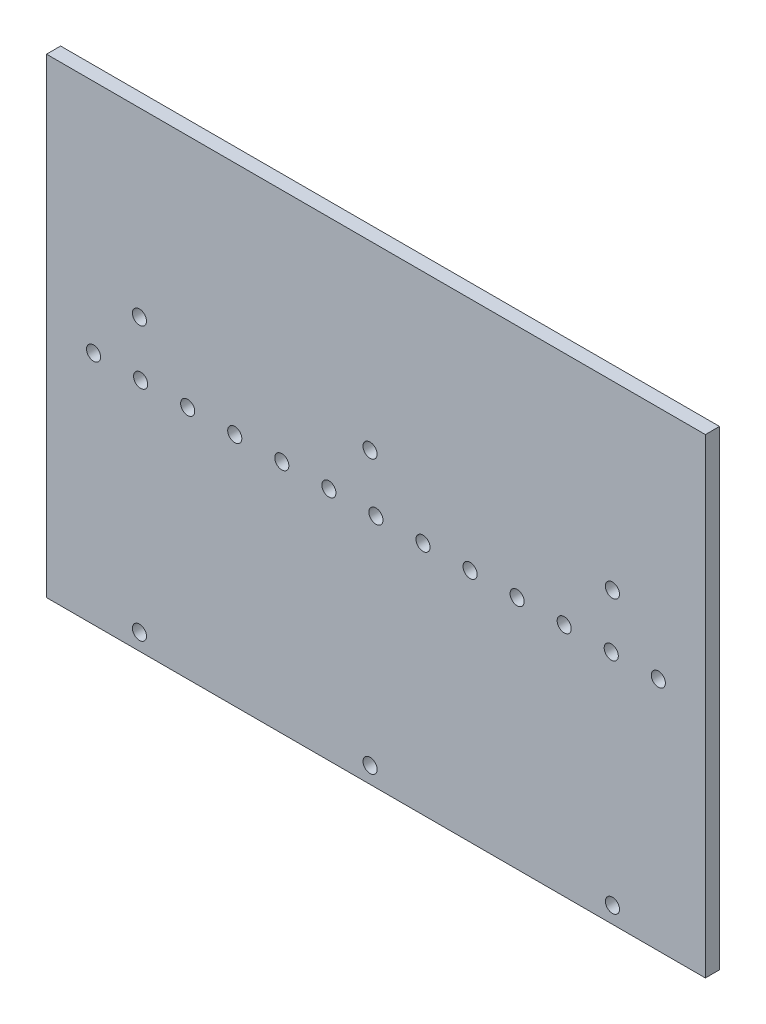
ISO-10303-21;
HEADER;
FILE_DESCRIPTION(('STEP AP214'),'2;1');
FILE_NAME('part.step','',(''),(''),'','','');
FILE_SCHEMA(('AUTOMOTIVE_DESIGN { 1 0 10303 214 1 1 1 1 }'));
ENDSEC;
DATA;
#1=APPLICATION_CONTEXT('core data for automotive mechanical design processes');
#2=APPLICATION_PROTOCOL_DEFINITION('international standard','automotive_design',2000,#1);
#3=PRODUCT_CONTEXT('',#1,'mechanical');
#4=PRODUCT('Part','Part','',(#3));
#5=PRODUCT_RELATED_PRODUCT_CATEGORY('part','',(#4));
#6=PRODUCT_DEFINITION_FORMATION('','',#4);
#7=PRODUCT_DEFINITION_CONTEXT('part definition',#1,'design');
#8=PRODUCT_DEFINITION('design','',#6,#7);
#9=PRODUCT_DEFINITION_SHAPE('','',#8);
#10=(LENGTH_UNIT() NAMED_UNIT(*) SI_UNIT(.MILLI.,.METRE.));
#11=(NAMED_UNIT(*) PLANE_ANGLE_UNIT() SI_UNIT($,.RADIAN.));
#12=(NAMED_UNIT(*) SI_UNIT($,.STERADIAN.) SOLID_ANGLE_UNIT());
#13=UNCERTAINTY_MEASURE_WITH_UNIT(LENGTH_MEASURE(1.E-05),#10,'distance_accuracy_value','');
#14=(GEOMETRIC_REPRESENTATION_CONTEXT(3) GLOBAL_UNCERTAINTY_ASSIGNED_CONTEXT((#13)) GLOBAL_UNIT_ASSIGNED_CONTEXT((#10,
#11,#12)) REPRESENTATION_CONTEXT('',''));
#15=CARTESIAN_POINT('',(0.,0.,0.));
#16=DIRECTION('',(0.,0.,1.));
#17=DIRECTION('',(1.,0.,0.));
#18=AXIS2_PLACEMENT_3D('',#15,#16,#17);
#19=CARTESIAN_POINT('',(70.,50.,3.));
#20=DIRECTION('',(-1.,0.,0.));
#21=DIRECTION('',(0.,0.,1.));
#22=AXIS2_PLACEMENT_3D('',#19,#20,#21);
#23=PLANE('',#22);
#24=DIRECTION('',(0.,1.,0.));
#25=VECTOR('',#24,1.);
#26=CARTESIAN_POINT('',(70.,50.,0.));
#27=LINE('',#26,#25);
#28=CARTESIAN_POINT('',(70.,-50.,0.));
#29=VERTEX_POINT('',#28);
#30=CARTESIAN_POINT('',(70.,50.,0.));
#31=VERTEX_POINT('',#30);
#32=EDGE_CURVE('E114',#29,#31,#27,.T.);
#33=ORIENTED_EDGE('',*,*,#32,.T.);
#34=DIRECTION('',(0.,0.,-1.));
#35=VECTOR('',#34,1.);
#36=CARTESIAN_POINT('',(70.,50.,3.));
#37=LINE('',#36,#35);
#38=CARTESIAN_POINT('',(70.,50.,3.));
#39=VERTEX_POINT('',#38);
#40=EDGE_CURVE('E11',#39,#31,#37,.T.);
#41=ORIENTED_EDGE('',*,*,#40,.F.);
#42=DIRECTION('',(0.,1.,0.));
#43=VECTOR('',#42,1.);
#44=CARTESIAN_POINT('',(70.,50.,3.));
#45=LINE('',#44,#43);
#46=CARTESIAN_POINT('',(70.,-50.,3.));
#47=VERTEX_POINT('',#46);
#48=EDGE_CURVE('E97',#47,#39,#45,.T.);
#49=ORIENTED_EDGE('',*,*,#48,.F.);
#50=DIRECTION('',(0.,0.,-1.));
#51=VECTOR('',#50,1.);
#52=CARTESIAN_POINT('',(70.,-50.,3.));
#53=LINE('',#52,#51);
#54=EDGE_CURVE('E110',#47,#29,#53,.T.);
#55=ORIENTED_EDGE('',*,*,#54,.T.);
#56=EDGE_LOOP('',(#33,#41,#49,#55));
#57=FACE_BOUND('',#56,.T.);
#58=ADVANCED_FACE('F43',(#57),#23,.F.);
#59=CARTESIAN_POINT('',(-70.,50.,3.));
#60=DIRECTION('',(0.,-1.,0.));
#61=DIRECTION('',(0.,0.,-1.));
#62=AXIS2_PLACEMENT_3D('',#59,#60,#61);
#63=PLANE('',#62);
#64=DIRECTION('',(-1.,0.,0.));
#65=VECTOR('',#64,1.);
#66=CARTESIAN_POINT('',(-70.,50.,0.));
#67=LINE('',#66,#65);
#68=CARTESIAN_POINT('',(-70.,50.,0.));
#69=VERTEX_POINT('',#68);
#70=EDGE_CURVE('E102',#31,#69,#67,.T.);
#71=ORIENTED_EDGE('',*,*,#70,.T.);
#72=DIRECTION('',(0.,0.,-1.));
#73=VECTOR('',#72,1.);
#74=CARTESIAN_POINT('',(-70.,50.,3.));
#75=LINE('',#74,#73);
#76=CARTESIAN_POINT('',(-70.,50.,3.));
#77=VERTEX_POINT('',#76);
#78=EDGE_CURVE('E53',#77,#69,#75,.T.);
#79=ORIENTED_EDGE('',*,*,#78,.F.);
#80=DIRECTION('',(-1.,0.,0.));
#81=VECTOR('',#80,1.);
#82=CARTESIAN_POINT('',(-70.,50.,3.));
#83=LINE('',#82,#81);
#84=EDGE_CURVE('E92',#39,#77,#83,.T.);
#85=ORIENTED_EDGE('',*,*,#84,.F.);
#86=ORIENTED_EDGE('',*,*,#40,.T.);
#87=EDGE_LOOP('',(#71,#79,#85,#86));
#88=FACE_BOUND('',#87,.T.);
#89=ADVANCED_FACE('F101',(#88),#63,.F.);
#90=CARTESIAN_POINT('',(-70.,50.,3.));
#91=DIRECTION('',(1.,0.,0.));
#92=DIRECTION('',(0.,1.,0.));
#93=AXIS2_PLACEMENT_3D('',#90,#91,#92);
#94=PLANE('',#93);
#95=DIRECTION('',(0.,-1.,0.));
#96=VECTOR('',#95,1.);
#97=CARTESIAN_POINT('',(-70.,50.,0.));
#98=LINE('',#97,#96);
#99=CARTESIAN_POINT('',(-70.,-50.,0.));
#100=VERTEX_POINT('',#99);
#101=EDGE_CURVE('E79',#69,#100,#98,.T.);
#102=ORIENTED_EDGE('',*,*,#101,.T.);
#103=DIRECTION('',(0.,0.,-1.));
#104=VECTOR('',#103,1.);
#105=CARTESIAN_POINT('',(-70.,-50.,3.));
#106=LINE('',#105,#104);
#107=CARTESIAN_POINT('',(-70.,-50.,3.));
#108=VERTEX_POINT('',#107);
#109=EDGE_CURVE('E104',#108,#100,#106,.T.);
#110=ORIENTED_EDGE('',*,*,#109,.F.);
#111=DIRECTION('',(0.,-1.,0.));
#112=VECTOR('',#111,1.);
#113=CARTESIAN_POINT('',(-70.,50.,3.));
#114=LINE('',#113,#112);
#115=EDGE_CURVE('E95',#77,#108,#114,.T.);
#116=ORIENTED_EDGE('',*,*,#115,.F.);
#117=ORIENTED_EDGE('',*,*,#78,.T.);
#118=EDGE_LOOP('',(#102,#110,#116,#117));
#119=FACE_BOUND('',#118,.T.);
#120=ADVANCED_FACE('F106',(#119),#94,.F.);
#121=CARTESIAN_POINT('',(-70.,-50.,3.));
#122=DIRECTION('',(0.,1.,0.));
#123=DIRECTION('',(0.,0.,1.));
#124=AXIS2_PLACEMENT_3D('',#121,#122,#123);
#125=PLANE('',#124);
#126=DIRECTION('',(1.,0.,0.));
#127=VECTOR('',#126,1.);
#128=CARTESIAN_POINT('',(-70.,-50.,0.));
#129=LINE('',#128,#127);
#130=EDGE_CURVE('E85',#100,#29,#129,.T.);
#131=ORIENTED_EDGE('',*,*,#130,.T.);
#132=ORIENTED_EDGE('',*,*,#54,.F.);
#133=DIRECTION('',(1.,0.,0.));
#134=VECTOR('',#133,1.);
#135=CARTESIAN_POINT('',(-70.,-50.,3.));
#136=LINE('',#135,#134);
#137=EDGE_CURVE('E62',#108,#47,#136,.T.);
#138=ORIENTED_EDGE('',*,*,#137,.F.);
#139=ORIENTED_EDGE('',*,*,#109,.T.);
#140=EDGE_LOOP('',(#131,#132,#138,#139));
#141=FACE_BOUND('',#140,.T.);
#142=ADVANCED_FACE('F293',(#141),#125,.F.);
#143=CARTESIAN_POINT('',(0.,0.,3.));
#144=DIRECTION('',(0.,0.,1.));
#145=DIRECTION('',(1.,0.,0.));
#146=AXIS2_PLACEMENT_3D('',#143,#144,#145);
#147=PLANE('',#146);
#148=CARTESIAN_POINT('',(50.25,-46.5,3.));
#149=DIRECTION('',(0.,0.,1.));
#150=DIRECTION('',(1.,0.,0.));
#151=AXIS2_PLACEMENT_3D('',#148,#149,#150);
#152=CIRCLE('',#151,1.5);
#153=CARTESIAN_POINT('',(51.75,-46.5,3.));
#154=VERTEX_POINT('',#153);
#155=EDGE_CURVE('E266',#154,#154,#152,.T.);
#156=ORIENTED_EDGE('',*,*,#155,.F.);
#157=EDGE_LOOP('',(#156));
#158=FACE_BOUND('',#157,.T.);
#159=CARTESIAN_POINT('',(-50.25,-46.5,3.));
#160=DIRECTION('',(0.,0.,1.));
#161=DIRECTION('',(1.,0.,0.));
#162=AXIS2_PLACEMENT_3D('',#159,#160,#161);
#163=CIRCLE('',#162,1.5);
#164=CARTESIAN_POINT('',(-48.75,-46.5,3.));
#165=VERTEX_POINT('',#164);
#166=EDGE_CURVE('E276',#165,#165,#163,.T.);
#167=ORIENTED_EDGE('',*,*,#166,.F.);
#168=EDGE_LOOP('',(#167));
#169=FACE_BOUND('',#168,.T.);
#170=CARTESIAN_POINT('',(-1.24999999999998,11.5,3.));
#171=DIRECTION('',(0.,0.,1.));
#172=DIRECTION('',(1.,0.,0.));
#173=AXIS2_PLACEMENT_3D('',#170,#171,#172);
#174=CIRCLE('',#173,1.5);
#175=CARTESIAN_POINT('',(0.25000000000002,11.5,3.));
#176=VERTEX_POINT('',#175);
#177=EDGE_CURVE('E271',#176,#176,#174,.T.);
#178=ORIENTED_EDGE('',*,*,#177,.F.);
#179=EDGE_LOOP('',(#178));
#180=FACE_BOUND('',#179,.T.);
#181=CARTESIAN_POINT('',(50.25,11.5,3.));
#182=DIRECTION('',(0.,0.,1.));
#183=DIRECTION('',(1.,0.,0.));
#184=AXIS2_PLACEMENT_3D('',#181,#182,#183);
#185=CIRCLE('',#184,1.5);
#186=CARTESIAN_POINT('',(51.75,11.5,3.));
#187=VERTEX_POINT('',#186);
#188=EDGE_CURVE('E267',#187,#187,#185,.T.);
#189=ORIENTED_EDGE('',*,*,#188,.F.);
#190=EDGE_LOOP('',(#189));
#191=FACE_BOUND('',#190,.T.);
#192=CARTESIAN_POINT('',(-50.25,11.5,3.));
#193=DIRECTION('',(0.,0.,1.));
#194=DIRECTION('',(1.,0.,0.));
#195=AXIS2_PLACEMENT_3D('',#192,#193,#194);
#196=CIRCLE('',#195,1.5);
#197=CARTESIAN_POINT('',(-48.75,11.5,3.));
#198=VERTEX_POINT('',#197);
#199=EDGE_CURVE('E272',#198,#198,#196,.T.);
#200=ORIENTED_EDGE('',*,*,#199,.F.);
#201=EDGE_LOOP('',(#200));
#202=FACE_BOUND('',#201,.T.);
#203=CARTESIAN_POINT('',(-1.24999999999998,-46.5,3.));
#204=DIRECTION('',(0.,0.,1.));
#205=DIRECTION('',(1.,0.,0.));
#206=AXIS2_PLACEMENT_3D('',#203,#204,#205);
#207=CIRCLE('',#206,1.5);
#208=CARTESIAN_POINT('',(0.25000000000002,-46.5,3.));
#209=VERTEX_POINT('',#208);
#210=EDGE_CURVE('E186',#209,#209,#207,.T.);
#211=ORIENTED_EDGE('',*,*,#210,.F.);
#212=EDGE_LOOP('',(#211));
#213=FACE_BOUND('',#212,.T.);
#214=CARTESIAN_POINT('',(-60.,-4.18977760661176E-13,3.));
#215=DIRECTION('',(0.,0.,1.));
#216=DIRECTION('',(1.,0.,0.));
#217=AXIS2_PLACEMENT_3D('',#214,#215,#216);
#218=CIRCLE('',#217,1.5);
#219=CARTESIAN_POINT('',(-58.5,-4.18977760661176E-13,3.));
#220=VERTEX_POINT('',#219);
#221=EDGE_CURVE('E204',#220,#220,#218,.T.);
#222=ORIENTED_EDGE('',*,*,#221,.F.);
#223=EDGE_LOOP('',(#222));
#224=FACE_BOUND('',#223,.T.);
#225=CARTESIAN_POINT('',(-50.,-3.49148133884313E-13,3.));
#226=DIRECTION('',(0.,0.,1.));
#227=DIRECTION('',(1.,0.,0.));
#228=AXIS2_PLACEMENT_3D('',#225,#226,#227);
#229=CIRCLE('',#228,1.5);
#230=CARTESIAN_POINT('',(-48.5,-3.49148133884313E-13,3.));
#231=VERTEX_POINT('',#230);
#232=EDGE_CURVE('E209',#231,#231,#229,.T.);
#233=ORIENTED_EDGE('',*,*,#232,.F.);
#234=EDGE_LOOP('',(#233));
#235=FACE_BOUND('',#234,.T.);
#236=CARTESIAN_POINT('',(-40.,-2.79318507107451E-13,3.));
#237=DIRECTION('',(0.,0.,1.));
#238=DIRECTION('',(1.,0.,0.));
#239=AXIS2_PLACEMENT_3D('',#236,#237,#238);
#240=CIRCLE('',#239,1.5);
#241=CARTESIAN_POINT('',(-38.5,-2.79318507107451E-13,3.));
#242=VERTEX_POINT('',#241);
#243=EDGE_CURVE('E215',#242,#242,#240,.T.);
#244=ORIENTED_EDGE('',*,*,#243,.F.);
#245=EDGE_LOOP('',(#244));
#246=FACE_BOUND('',#245,.T.);
#247=CARTESIAN_POINT('',(-30.,-2.09488880330588E-13,3.));
#248=DIRECTION('',(0.,0.,1.));
#249=DIRECTION('',(1.,0.,0.));
#250=AXIS2_PLACEMENT_3D('',#247,#248,#249);
#251=CIRCLE('',#250,1.5);
#252=CARTESIAN_POINT('',(-28.5,-2.09488880330588E-13,3.));
#253=VERTEX_POINT('',#252);
#254=EDGE_CURVE('E254',#253,#253,#251,.T.);
#255=ORIENTED_EDGE('',*,*,#254,.F.);
#256=EDGE_LOOP('',(#255));
#257=FACE_BOUND('',#256,.T.);
#258=CARTESIAN_POINT('',(10.,0.,3.));
#259=DIRECTION('',(0.,0.,1.));
#260=DIRECTION('',(1.,0.,0.));
#261=AXIS2_PLACEMENT_3D('',#258,#259,#260);
#262=CIRCLE('',#261,1.5);
#263=CARTESIAN_POINT('',(11.5,0.,3.));
#264=VERTEX_POINT('',#263);
#265=EDGE_CURVE('E221',#264,#264,#262,.T.);
#266=ORIENTED_EDGE('',*,*,#265,.F.);
#267=EDGE_LOOP('',(#266));
#268=FACE_BOUND('',#267,.T.);
#269=CARTESIAN_POINT('',(20.,0.,3.));
#270=DIRECTION('',(0.,0.,1.));
#271=DIRECTION('',(1.,0.,0.));
#272=AXIS2_PLACEMENT_3D('',#269,#270,#271);
#273=CIRCLE('',#272,1.5);
#274=CARTESIAN_POINT('',(21.5,0.,3.));
#275=VERTEX_POINT('',#274);
#276=EDGE_CURVE('E226',#275,#275,#273,.T.);
#277=ORIENTED_EDGE('',*,*,#276,.F.);
#278=EDGE_LOOP('',(#277));
#279=FACE_BOUND('',#278,.T.);
#280=CARTESIAN_POINT('',(30.,0.,3.));
#281=DIRECTION('',(0.,0.,1.));
#282=DIRECTION('',(1.,0.,0.));
#283=AXIS2_PLACEMENT_3D('',#280,#281,#282);
#284=CIRCLE('',#283,1.5);
#285=CARTESIAN_POINT('',(31.5,0.,3.));
#286=VERTEX_POINT('',#285);
#287=EDGE_CURVE('E230',#286,#286,#284,.T.);
#288=ORIENTED_EDGE('',*,*,#287,.F.);
#289=EDGE_LOOP('',(#288));
#290=FACE_BOUND('',#289,.T.);
#291=CARTESIAN_POINT('',(40.,0.,3.));
#292=DIRECTION('',(0.,0.,1.));
#293=DIRECTION('',(1.,0.,0.));
#294=AXIS2_PLACEMENT_3D('',#291,#292,#293);
#295=CIRCLE('',#294,1.5);
#296=CARTESIAN_POINT('',(41.5,0.,3.));
#297=VERTEX_POINT('',#296);
#298=EDGE_CURVE('E234',#297,#297,#295,.T.);
#299=ORIENTED_EDGE('',*,*,#298,.F.);
#300=EDGE_LOOP('',(#299));
#301=FACE_BOUND('',#300,.T.);
#302=CARTESIAN_POINT('',(50.,0.,3.));
#303=DIRECTION('',(0.,0.,1.));
#304=DIRECTION('',(1.,0.,0.));
#305=AXIS2_PLACEMENT_3D('',#302,#303,#304);
#306=CIRCLE('',#305,1.5);
#307=CARTESIAN_POINT('',(51.5,0.,3.));
#308=VERTEX_POINT('',#307);
#309=EDGE_CURVE('E238',#308,#308,#306,.T.);
#310=ORIENTED_EDGE('',*,*,#309,.F.);
#311=EDGE_LOOP('',(#310));
#312=FACE_BOUND('',#311,.T.);
#313=CARTESIAN_POINT('',(60.,0.,3.));
#314=DIRECTION('',(0.,0.,1.));
#315=DIRECTION('',(1.,0.,0.));
#316=AXIS2_PLACEMENT_3D('',#313,#314,#315);
#317=CIRCLE('',#316,1.5);
#318=CARTESIAN_POINT('',(61.5,0.,3.));
#319=VERTEX_POINT('',#318);
#320=EDGE_CURVE('E242',#319,#319,#317,.T.);
#321=ORIENTED_EDGE('',*,*,#320,.F.);
#322=EDGE_LOOP('',(#321));
#323=FACE_BOUND('',#322,.T.);
#324=CARTESIAN_POINT('',(-10.,0.,3.));
#325=DIRECTION('',(0.,0.,1.));
#326=DIRECTION('',(1.,0.,0.));
#327=AXIS2_PLACEMENT_3D('',#324,#325,#326);
#328=CIRCLE('',#327,1.5);
#329=CARTESIAN_POINT('',(-8.5,0.,3.));
#330=VERTEX_POINT('',#329);
#331=EDGE_CURVE('E246',#330,#330,#328,.T.);
#332=ORIENTED_EDGE('',*,*,#331,.F.);
#333=EDGE_LOOP('',(#332));
#334=FACE_BOUND('',#333,.T.);
#335=CARTESIAN_POINT('',(-20.,-1.39659253553725E-13,3.));
#336=DIRECTION('',(0.,0.,1.));
#337=DIRECTION('',(1.,0.,0.));
#338=AXIS2_PLACEMENT_3D('',#335,#336,#337);
#339=CIRCLE('',#338,1.5);
#340=CARTESIAN_POINT('',(-18.5,-1.39659253553725E-13,3.));
#341=VERTEX_POINT('',#340);
#342=EDGE_CURVE('E250',#341,#341,#339,.T.);
#343=ORIENTED_EDGE('',*,*,#342,.F.);
#344=EDGE_LOOP('',(#343));
#345=FACE_BOUND('',#344,.T.);
#346=CARTESIAN_POINT('',(0.,0.,3.));
#347=DIRECTION('',(0.,0.,1.));
#348=DIRECTION('',(1.,0.,0.));
#349=AXIS2_PLACEMENT_3D('',#346,#347,#348);
#350=CIRCLE('',#349,1.5);
#351=CARTESIAN_POINT('',(1.5,0.,3.));
#352=VERTEX_POINT('',#351);
#353=EDGE_CURVE('E134',#352,#352,#350,.T.);
#354=ORIENTED_EDGE('',*,*,#353,.F.);
#355=EDGE_LOOP('',(#354));
#356=FACE_BOUND('',#355,.T.);
#357=ORIENTED_EDGE('',*,*,#48,.T.);
#358=ORIENTED_EDGE('',*,*,#84,.T.);
#359=ORIENTED_EDGE('',*,*,#115,.T.);
#360=ORIENTED_EDGE('',*,*,#137,.T.);
#361=EDGE_LOOP('',(#357,#358,#359,#360));
#362=FACE_BOUND('',#361,.T.);
#363=ADVANCED_FACE('F93',(#158,#169,#180,#191,#202,#213,#224,#235,#246,#257,#268,#279,#290,#301,
#312,#323,#334,#345,#356,#362),#147,.T.);
#364=CARTESIAN_POINT('',(0.,0.,0.));
#365=DIRECTION('',(0.,0.,1.));
#366=DIRECTION('',(1.,0.,0.));
#367=AXIS2_PLACEMENT_3D('',#364,#365,#366);
#368=PLANE('',#367);
#369=CARTESIAN_POINT('',(50.25,-46.5,0.));
#370=DIRECTION('',(0.,0.,1.));
#371=DIRECTION('',(1.,0.,0.));
#372=AXIS2_PLACEMENT_3D('',#369,#370,#371);
#373=CIRCLE('',#372,1.5);
#374=CARTESIAN_POINT('',(51.75,-46.5,0.));
#375=VERTEX_POINT('',#374);
#376=EDGE_CURVE('E46',#375,#375,#373,.T.);
#377=ORIENTED_EDGE('',*,*,#376,.T.);
#378=EDGE_LOOP('',(#377));
#379=FACE_BOUND('',#378,.T.);
#380=CARTESIAN_POINT('',(-50.25,-46.5,0.));
#381=DIRECTION('',(0.,0.,1.));
#382=DIRECTION('',(1.,0.,0.));
#383=AXIS2_PLACEMENT_3D('',#380,#381,#382);
#384=CIRCLE('',#383,1.5);
#385=CARTESIAN_POINT('',(-48.75,-46.5,0.));
#386=VERTEX_POINT('',#385);
#387=EDGE_CURVE('E197',#386,#386,#384,.T.);
#388=ORIENTED_EDGE('',*,*,#387,.T.);
#389=EDGE_LOOP('',(#388));
#390=FACE_BOUND('',#389,.T.);
#391=CARTESIAN_POINT('',(-1.24999999999998,11.5,0.));
#392=DIRECTION('',(0.,0.,1.));
#393=DIRECTION('',(1.,0.,0.));
#394=AXIS2_PLACEMENT_3D('',#391,#392,#393);
#395=CIRCLE('',#394,1.5);
#396=CARTESIAN_POINT('',(0.25000000000002,11.5,0.));
#397=VERTEX_POINT('',#396);
#398=EDGE_CURVE('E194',#397,#397,#395,.T.);
#399=ORIENTED_EDGE('',*,*,#398,.T.);
#400=EDGE_LOOP('',(#399));
#401=FACE_BOUND('',#400,.T.);
#402=CARTESIAN_POINT('',(50.25,11.5,0.));
#403=DIRECTION('',(0.,0.,1.));
#404=DIRECTION('',(1.,0.,0.));
#405=AXIS2_PLACEMENT_3D('',#402,#403,#404);
#406=CIRCLE('',#405,1.5);
#407=CARTESIAN_POINT('',(51.75,11.5,0.));
#408=VERTEX_POINT('',#407);
#409=EDGE_CURVE('E190',#408,#408,#406,.T.);
#410=ORIENTED_EDGE('',*,*,#409,.T.);
#411=EDGE_LOOP('',(#410));
#412=FACE_BOUND('',#411,.T.);
#413=CARTESIAN_POINT('',(-50.25,11.5,0.));
#414=DIRECTION('',(0.,0.,1.));
#415=DIRECTION('',(1.,0.,0.));
#416=AXIS2_PLACEMENT_3D('',#413,#414,#415);
#417=CIRCLE('',#416,1.5);
#418=CARTESIAN_POINT('',(-48.75,11.5,0.));
#419=VERTEX_POINT('',#418);
#420=EDGE_CURVE('E185',#419,#419,#417,.T.);
#421=ORIENTED_EDGE('',*,*,#420,.T.);
#422=EDGE_LOOP('',(#421));
#423=FACE_BOUND('',#422,.T.);
#424=CARTESIAN_POINT('',(-1.24999999999998,-46.5,0.));
#425=DIRECTION('',(0.,0.,1.));
#426=DIRECTION('',(1.,0.,0.));
#427=AXIS2_PLACEMENT_3D('',#424,#425,#426);
#428=CIRCLE('',#427,1.5);
#429=CARTESIAN_POINT('',(0.25000000000002,-46.5,0.));
#430=VERTEX_POINT('',#429);
#431=EDGE_CURVE('E181',#430,#430,#428,.T.);
#432=ORIENTED_EDGE('',*,*,#431,.T.);
#433=EDGE_LOOP('',(#432));
#434=FACE_BOUND('',#433,.T.);
#435=CARTESIAN_POINT('',(-60.,-4.18977760661176E-13,0.));
#436=DIRECTION('',(0.,0.,1.));
#437=DIRECTION('',(1.,0.,0.));
#438=AXIS2_PLACEMENT_3D('',#435,#436,#437);
#439=CIRCLE('',#438,1.5);
#440=CARTESIAN_POINT('',(-58.5,-4.18977760661176E-13,0.));
#441=VERTEX_POINT('',#440);
#442=EDGE_CURVE('E118',#441,#441,#439,.T.);
#443=ORIENTED_EDGE('',*,*,#442,.T.);
#444=EDGE_LOOP('',(#443));
#445=FACE_BOUND('',#444,.T.);
#446=CARTESIAN_POINT('',(-50.,-3.49148133884313E-13,0.));
#447=DIRECTION('',(0.,0.,1.));
#448=DIRECTION('',(1.,0.,0.));
#449=AXIS2_PLACEMENT_3D('',#446,#447,#448);
#450=CIRCLE('',#449,1.5);
#451=CARTESIAN_POINT('',(-48.5,-3.49148133884313E-13,0.));
#452=VERTEX_POINT('',#451);
#453=EDGE_CURVE('E174',#452,#452,#450,.T.);
#454=ORIENTED_EDGE('',*,*,#453,.T.);
#455=EDGE_LOOP('',(#454));
#456=FACE_BOUND('',#455,.T.);
#457=CARTESIAN_POINT('',(-40.,-2.79318507107451E-13,0.));
#458=DIRECTION('',(0.,0.,1.));
#459=DIRECTION('',(1.,0.,0.));
#460=AXIS2_PLACEMENT_3D('',#457,#458,#459);
#461=CIRCLE('',#460,1.5);
#462=CARTESIAN_POINT('',(-38.5,-2.79318507107451E-13,0.));
#463=VERTEX_POINT('',#462);
#464=EDGE_CURVE('E170',#463,#463,#461,.T.);
#465=ORIENTED_EDGE('',*,*,#464,.T.);
#466=EDGE_LOOP('',(#465));
#467=FACE_BOUND('',#466,.T.);
#468=CARTESIAN_POINT('',(-30.,-2.09488880330588E-13,0.));
#469=DIRECTION('',(0.,0.,1.));
#470=DIRECTION('',(1.,0.,0.));
#471=AXIS2_PLACEMENT_3D('',#468,#469,#470);
#472=CIRCLE('',#471,1.5);
#473=CARTESIAN_POINT('',(-28.5,-2.09488880330588E-13,0.));
#474=VERTEX_POINT('',#473);
#475=EDGE_CURVE('E166',#474,#474,#472,.T.);
#476=ORIENTED_EDGE('',*,*,#475,.T.);
#477=EDGE_LOOP('',(#476));
#478=FACE_BOUND('',#477,.T.);
#479=CARTESIAN_POINT('',(10.,0.,0.));
#480=DIRECTION('',(0.,0.,1.));
#481=DIRECTION('',(1.,0.,0.));
#482=AXIS2_PLACEMENT_3D('',#479,#480,#481);
#483=CIRCLE('',#482,1.5);
#484=CARTESIAN_POINT('',(11.5,0.,0.));
#485=VERTEX_POINT('',#484);
#486=EDGE_CURVE('E162',#485,#485,#483,.T.);
#487=ORIENTED_EDGE('',*,*,#486,.T.);
#488=EDGE_LOOP('',(#487));
#489=FACE_BOUND('',#488,.T.);
#490=CARTESIAN_POINT('',(20.,0.,0.));
#491=DIRECTION('',(0.,0.,1.));
#492=DIRECTION('',(1.,0.,0.));
#493=AXIS2_PLACEMENT_3D('',#490,#491,#492);
#494=CIRCLE('',#493,1.5);
#495=CARTESIAN_POINT('',(21.5,0.,0.));
#496=VERTEX_POINT('',#495);
#497=EDGE_CURVE('E158',#496,#496,#494,.T.);
#498=ORIENTED_EDGE('',*,*,#497,.T.);
#499=EDGE_LOOP('',(#498));
#500=FACE_BOUND('',#499,.T.);
#501=CARTESIAN_POINT('',(30.,0.,0.));
#502=DIRECTION('',(0.,0.,1.));
#503=DIRECTION('',(1.,0.,0.));
#504=AXIS2_PLACEMENT_3D('',#501,#502,#503);
#505=CIRCLE('',#504,1.5);
#506=CARTESIAN_POINT('',(31.5,0.,0.));
#507=VERTEX_POINT('',#506);
#508=EDGE_CURVE('E154',#507,#507,#505,.T.);
#509=ORIENTED_EDGE('',*,*,#508,.T.);
#510=EDGE_LOOP('',(#509));
#511=FACE_BOUND('',#510,.T.);
#512=CARTESIAN_POINT('',(40.,0.,0.));
#513=DIRECTION('',(0.,0.,1.));
#514=DIRECTION('',(1.,0.,0.));
#515=AXIS2_PLACEMENT_3D('',#512,#513,#514);
#516=CIRCLE('',#515,1.5);
#517=CARTESIAN_POINT('',(41.5,0.,0.));
#518=VERTEX_POINT('',#517);
#519=EDGE_CURVE('E150',#518,#518,#516,.T.);
#520=ORIENTED_EDGE('',*,*,#519,.T.);
#521=EDGE_LOOP('',(#520));
#522=FACE_BOUND('',#521,.T.);
#523=CARTESIAN_POINT('',(50.,0.,0.));
#524=DIRECTION('',(0.,0.,1.));
#525=DIRECTION('',(1.,0.,0.));
#526=AXIS2_PLACEMENT_3D('',#523,#524,#525);
#527=CIRCLE('',#526,1.5);
#528=CARTESIAN_POINT('',(51.5,0.,0.));
#529=VERTEX_POINT('',#528);
#530=EDGE_CURVE('E146',#529,#529,#527,.T.);
#531=ORIENTED_EDGE('',*,*,#530,.T.);
#532=EDGE_LOOP('',(#531));
#533=FACE_BOUND('',#532,.T.);
#534=CARTESIAN_POINT('',(60.,0.,0.));
#535=DIRECTION('',(0.,0.,1.));
#536=DIRECTION('',(1.,0.,0.));
#537=AXIS2_PLACEMENT_3D('',#534,#535,#536);
#538=CIRCLE('',#537,1.5);
#539=CARTESIAN_POINT('',(61.5,0.,0.));
#540=VERTEX_POINT('',#539);
#541=EDGE_CURVE('E142',#540,#540,#538,.T.);
#542=ORIENTED_EDGE('',*,*,#541,.T.);
#543=EDGE_LOOP('',(#542));
#544=FACE_BOUND('',#543,.T.);
#545=CARTESIAN_POINT('',(-10.,0.,0.));
#546=DIRECTION('',(0.,0.,1.));
#547=DIRECTION('',(1.,0.,0.));
#548=AXIS2_PLACEMENT_3D('',#545,#546,#547);
#549=CIRCLE('',#548,1.5);
#550=CARTESIAN_POINT('',(-8.5,0.,0.));
#551=VERTEX_POINT('',#550);
#552=EDGE_CURVE('E138',#551,#551,#549,.T.);
#553=ORIENTED_EDGE('',*,*,#552,.T.);
#554=EDGE_LOOP('',(#553));
#555=FACE_BOUND('',#554,.T.);
#556=CARTESIAN_POINT('',(-20.,-1.39659253553725E-13,0.));
#557=DIRECTION('',(0.,0.,1.));
#558=DIRECTION('',(1.,0.,0.));
#559=AXIS2_PLACEMENT_3D('',#556,#557,#558);
#560=CIRCLE('',#559,1.5);
#561=CARTESIAN_POINT('',(-18.5,-1.39659253553725E-13,0.));
#562=VERTEX_POINT('',#561);
#563=EDGE_CURVE('E133',#562,#562,#560,.T.);
#564=ORIENTED_EDGE('',*,*,#563,.T.);
#565=EDGE_LOOP('',(#564));
#566=FACE_BOUND('',#565,.T.);
#567=CARTESIAN_POINT('',(0.,0.,0.));
#568=DIRECTION('',(0.,0.,1.));
#569=DIRECTION('',(1.,0.,0.));
#570=AXIS2_PLACEMENT_3D('',#567,#568,#569);
#571=CIRCLE('',#570,1.5);
#572=CARTESIAN_POINT('',(1.5,0.,0.));
#573=VERTEX_POINT('',#572);
#574=EDGE_CURVE('E129',#573,#573,#571,.T.);
#575=ORIENTED_EDGE('',*,*,#574,.T.);
#576=EDGE_LOOP('',(#575));
#577=FACE_BOUND('',#576,.T.);
#578=ORIENTED_EDGE('',*,*,#32,.F.);
#579=ORIENTED_EDGE('',*,*,#130,.F.);
#580=ORIENTED_EDGE('',*,*,#101,.F.);
#581=ORIENTED_EDGE('',*,*,#70,.F.);
#582=EDGE_LOOP('',(#578,#579,#580,#581));
#583=FACE_BOUND('',#582,.T.);
#584=ADVANCED_FACE('F292',(#379,#390,#401,#412,#423,#434,#445,#456,#467,#478,#489,#500,#511,
#522,#533,#544,#555,#566,#577,#583),#368,.F.);
#585=CARTESIAN_POINT('',(0.,0.,-1.));
#586=DIRECTION('',(0.,0.,1.));
#587=DIRECTION('',(1.,0.,0.));
#588=AXIS2_PLACEMENT_3D('',#585,#586,#587);
#589=CYLINDRICAL_SURFACE('',#588,1.5);
#590=ORIENTED_EDGE('',*,*,#353,.T.);
#591=EDGE_LOOP('',(#590));
#592=FACE_BOUND('',#591,.T.);
#593=ORIENTED_EDGE('',*,*,#574,.F.);
#594=EDGE_LOOP('',(#593));
#595=FACE_BOUND('',#594,.T.);
#596=ADVANCED_FACE('F322',(#592,#595),#589,.F.);
#597=CARTESIAN_POINT('',(-20.,-1.39659253553725E-13,-1.));
#598=DIRECTION('',(0.,0.,1.));
#599=DIRECTION('',(1.,0.,0.));
#600=AXIS2_PLACEMENT_3D('',#597,#598,#599);
#601=CYLINDRICAL_SURFACE('',#600,1.5);
#602=ORIENTED_EDGE('',*,*,#342,.T.);
#603=EDGE_LOOP('',(#602));
#604=FACE_BOUND('',#603,.T.);
#605=ORIENTED_EDGE('',*,*,#563,.F.);
#606=EDGE_LOOP('',(#605));
#607=FACE_BOUND('',#606,.T.);
#608=ADVANCED_FACE('F325',(#604,#607),#601,.F.);
#609=CARTESIAN_POINT('',(-10.,0.,-1.));
#610=DIRECTION('',(0.,0.,1.));
#611=DIRECTION('',(1.,0.,0.));
#612=AXIS2_PLACEMENT_3D('',#609,#610,#611);
#613=CYLINDRICAL_SURFACE('',#612,1.5);
#614=ORIENTED_EDGE('',*,*,#331,.T.);
#615=EDGE_LOOP('',(#614));
#616=FACE_BOUND('',#615,.T.);
#617=ORIENTED_EDGE('',*,*,#552,.F.);
#618=EDGE_LOOP('',(#617));
#619=FACE_BOUND('',#618,.T.);
#620=ADVANCED_FACE('F374',(#616,#619),#613,.F.);
#621=CARTESIAN_POINT('',(60.,0.,-1.));
#622=DIRECTION('',(0.,0.,1.));
#623=DIRECTION('',(1.,0.,0.));
#624=AXIS2_PLACEMENT_3D('',#621,#622,#623);
#625=CYLINDRICAL_SURFACE('',#624,1.5);
#626=ORIENTED_EDGE('',*,*,#320,.T.);
#627=EDGE_LOOP('',(#626));
#628=FACE_BOUND('',#627,.T.);
#629=ORIENTED_EDGE('',*,*,#541,.F.);
#630=EDGE_LOOP('',(#629));
#631=FACE_BOUND('',#630,.T.);
#632=ADVANCED_FACE('F385',(#628,#631),#625,.F.);
#633=CARTESIAN_POINT('',(50.,0.,-1.));
#634=DIRECTION('',(0.,0.,1.));
#635=DIRECTION('',(1.,0.,0.));
#636=AXIS2_PLACEMENT_3D('',#633,#634,#635);
#637=CYLINDRICAL_SURFACE('',#636,1.5);
#638=ORIENTED_EDGE('',*,*,#309,.T.);
#639=EDGE_LOOP('',(#638));
#640=FACE_BOUND('',#639,.T.);
#641=ORIENTED_EDGE('',*,*,#530,.F.);
#642=EDGE_LOOP('',(#641));
#643=FACE_BOUND('',#642,.T.);
#644=ADVANCED_FACE('F396',(#640,#643),#637,.F.);
#645=CARTESIAN_POINT('',(40.,0.,-1.));
#646=DIRECTION('',(0.,0.,1.));
#647=DIRECTION('',(1.,0.,0.));
#648=AXIS2_PLACEMENT_3D('',#645,#646,#647);
#649=CYLINDRICAL_SURFACE('',#648,1.5);
#650=ORIENTED_EDGE('',*,*,#298,.T.);
#651=EDGE_LOOP('',(#650));
#652=FACE_BOUND('',#651,.T.);
#653=ORIENTED_EDGE('',*,*,#519,.F.);
#654=EDGE_LOOP('',(#653));
#655=FACE_BOUND('',#654,.T.);
#656=ADVANCED_FACE('F407',(#652,#655),#649,.F.);
#657=CARTESIAN_POINT('',(30.,0.,-1.));
#658=DIRECTION('',(0.,0.,1.));
#659=DIRECTION('',(1.,0.,0.));
#660=AXIS2_PLACEMENT_3D('',#657,#658,#659);
#661=CYLINDRICAL_SURFACE('',#660,1.5);
#662=ORIENTED_EDGE('',*,*,#287,.T.);
#663=EDGE_LOOP('',(#662));
#664=FACE_BOUND('',#663,.T.);
#665=ORIENTED_EDGE('',*,*,#508,.F.);
#666=EDGE_LOOP('',(#665));
#667=FACE_BOUND('',#666,.T.);
#668=ADVANCED_FACE('F418',(#664,#667),#661,.F.);
#669=CARTESIAN_POINT('',(20.,0.,-1.));
#670=DIRECTION('',(0.,0.,1.));
#671=DIRECTION('',(1.,0.,0.));
#672=AXIS2_PLACEMENT_3D('',#669,#670,#671);
#673=CYLINDRICAL_SURFACE('',#672,1.5);
#674=ORIENTED_EDGE('',*,*,#276,.T.);
#675=EDGE_LOOP('',(#674));
#676=FACE_BOUND('',#675,.T.);
#677=ORIENTED_EDGE('',*,*,#497,.F.);
#678=EDGE_LOOP('',(#677));
#679=FACE_BOUND('',#678,.T.);
#680=ADVANCED_FACE('F429',(#676,#679),#673,.F.);
#681=CARTESIAN_POINT('',(10.,0.,-1.));
#682=DIRECTION('',(0.,0.,1.));
#683=DIRECTION('',(1.,0.,0.));
#684=AXIS2_PLACEMENT_3D('',#681,#682,#683);
#685=CYLINDRICAL_SURFACE('',#684,1.5);
#686=ORIENTED_EDGE('',*,*,#265,.T.);
#687=EDGE_LOOP('',(#686));
#688=FACE_BOUND('',#687,.T.);
#689=ORIENTED_EDGE('',*,*,#486,.F.);
#690=EDGE_LOOP('',(#689));
#691=FACE_BOUND('',#690,.T.);
#692=ADVANCED_FACE('F440',(#688,#691),#685,.F.);
#693=CARTESIAN_POINT('',(-30.,-2.09488880330588E-13,-1.));
#694=DIRECTION('',(0.,0.,1.));
#695=DIRECTION('',(1.,0.,0.));
#696=AXIS2_PLACEMENT_3D('',#693,#694,#695);
#697=CYLINDRICAL_SURFACE('',#696,1.5);
#698=ORIENTED_EDGE('',*,*,#254,.T.);
#699=EDGE_LOOP('',(#698));
#700=FACE_BOUND('',#699,.T.);
#701=ORIENTED_EDGE('',*,*,#475,.F.);
#702=EDGE_LOOP('',(#701));
#703=FACE_BOUND('',#702,.T.);
#704=ADVANCED_FACE('F451',(#700,#703),#697,.F.);
#705=CARTESIAN_POINT('',(-40.,-2.79318507107451E-13,-1.));
#706=DIRECTION('',(0.,0.,1.));
#707=DIRECTION('',(1.,0.,0.));
#708=AXIS2_PLACEMENT_3D('',#705,#706,#707);
#709=CYLINDRICAL_SURFACE('',#708,1.5);
#710=ORIENTED_EDGE('',*,*,#243,.T.);
#711=EDGE_LOOP('',(#710));
#712=FACE_BOUND('',#711,.T.);
#713=ORIENTED_EDGE('',*,*,#464,.F.);
#714=EDGE_LOOP('',(#713));
#715=FACE_BOUND('',#714,.T.);
#716=ADVANCED_FACE('F462',(#712,#715),#709,.F.);
#717=CARTESIAN_POINT('',(-50.,-3.49148133884313E-13,-1.));
#718=DIRECTION('',(0.,0.,1.));
#719=DIRECTION('',(1.,0.,0.));
#720=AXIS2_PLACEMENT_3D('',#717,#718,#719);
#721=CYLINDRICAL_SURFACE('',#720,1.5);
#722=ORIENTED_EDGE('',*,*,#232,.T.);
#723=EDGE_LOOP('',(#722));
#724=FACE_BOUND('',#723,.T.);
#725=ORIENTED_EDGE('',*,*,#453,.F.);
#726=EDGE_LOOP('',(#725));
#727=FACE_BOUND('',#726,.T.);
#728=ADVANCED_FACE('F473',(#724,#727),#721,.F.);
#729=CARTESIAN_POINT('',(-60.,-4.18977760661176E-13,-1.));
#730=DIRECTION('',(0.,0.,1.));
#731=DIRECTION('',(1.,0.,0.));
#732=AXIS2_PLACEMENT_3D('',#729,#730,#731);
#733=CYLINDRICAL_SURFACE('',#732,1.5);
#734=ORIENTED_EDGE('',*,*,#221,.T.);
#735=EDGE_LOOP('',(#734));
#736=FACE_BOUND('',#735,.T.);
#737=ORIENTED_EDGE('',*,*,#442,.F.);
#738=EDGE_LOOP('',(#737));
#739=FACE_BOUND('',#738,.T.);
#740=ADVANCED_FACE('F483',(#736,#739),#733,.F.);
#741=CARTESIAN_POINT('',(-1.24999999999998,-46.5,-7.));
#742=DIRECTION('',(0.,0.,1.));
#743=DIRECTION('',(1.,0.,0.));
#744=AXIS2_PLACEMENT_3D('',#741,#742,#743);
#745=CYLINDRICAL_SURFACE('',#744,1.5);
#746=ORIENTED_EDGE('',*,*,#210,.T.);
#747=EDGE_LOOP('',(#746));
#748=FACE_BOUND('',#747,.T.);
#749=ORIENTED_EDGE('',*,*,#431,.F.);
#750=EDGE_LOOP('',(#749));
#751=FACE_BOUND('',#750,.T.);
#752=ADVANCED_FACE('F494',(#748,#751),#745,.F.);
#753=CARTESIAN_POINT('',(-50.25,11.5,-7.));
#754=DIRECTION('',(0.,0.,1.));
#755=DIRECTION('',(1.,0.,0.));
#756=AXIS2_PLACEMENT_3D('',#753,#754,#755);
#757=CYLINDRICAL_SURFACE('',#756,1.5);
#758=ORIENTED_EDGE('',*,*,#199,.T.);
#759=EDGE_LOOP('',(#758));
#760=FACE_BOUND('',#759,.T.);
#761=ORIENTED_EDGE('',*,*,#420,.F.);
#762=EDGE_LOOP('',(#761));
#763=FACE_BOUND('',#762,.T.);
#764=ADVANCED_FACE('F287',(#760,#763),#757,.F.);
#765=CARTESIAN_POINT('',(50.25,11.5,-7.));
#766=DIRECTION('',(0.,0.,1.));
#767=DIRECTION('',(1.,0.,0.));
#768=AXIS2_PLACEMENT_3D('',#765,#766,#767);
#769=CYLINDRICAL_SURFACE('',#768,1.5);
#770=ORIENTED_EDGE('',*,*,#188,.T.);
#771=EDGE_LOOP('',(#770));
#772=FACE_BOUND('',#771,.T.);
#773=ORIENTED_EDGE('',*,*,#409,.F.);
#774=EDGE_LOOP('',(#773));
#775=FACE_BOUND('',#774,.T.);
#776=ADVANCED_FACE('F526',(#772,#775),#769,.F.);
#777=CARTESIAN_POINT('',(-1.24999999999998,11.5,-7.));
#778=DIRECTION('',(0.,0.,1.));
#779=DIRECTION('',(1.,0.,0.));
#780=AXIS2_PLACEMENT_3D('',#777,#778,#779);
#781=CYLINDRICAL_SURFACE('',#780,1.5);
#782=ORIENTED_EDGE('',*,*,#177,.T.);
#783=EDGE_LOOP('',(#782));
#784=FACE_BOUND('',#783,.T.);
#785=ORIENTED_EDGE('',*,*,#398,.F.);
#786=EDGE_LOOP('',(#785));
#787=FACE_BOUND('',#786,.T.);
#788=ADVANCED_FACE('F536',(#784,#787),#781,.F.);
#789=CARTESIAN_POINT('',(-50.25,-46.5,-7.));
#790=DIRECTION('',(0.,0.,1.));
#791=DIRECTION('',(1.,0.,0.));
#792=AXIS2_PLACEMENT_3D('',#789,#790,#791);
#793=CYLINDRICAL_SURFACE('',#792,1.5);
#794=ORIENTED_EDGE('',*,*,#166,.T.);
#795=EDGE_LOOP('',(#794));
#796=FACE_BOUND('',#795,.T.);
#797=ORIENTED_EDGE('',*,*,#387,.F.);
#798=EDGE_LOOP('',(#797));
#799=FACE_BOUND('',#798,.T.);
#800=ADVANCED_FACE('F547',(#796,#799),#793,.F.);
#801=CARTESIAN_POINT('',(50.25,-46.5,-7.));
#802=DIRECTION('',(0.,0.,1.));
#803=DIRECTION('',(1.,0.,0.));
#804=AXIS2_PLACEMENT_3D('',#801,#802,#803);
#805=CYLINDRICAL_SURFACE('',#804,1.5);
#806=ORIENTED_EDGE('',*,*,#155,.T.);
#807=EDGE_LOOP('',(#806));
#808=FACE_BOUND('',#807,.T.);
#809=ORIENTED_EDGE('',*,*,#376,.F.);
#810=EDGE_LOOP('',(#809));
#811=FACE_BOUND('',#810,.T.);
#812=ADVANCED_FACE('F558',(#808,#811),#805,.F.);
#813=CLOSED_SHELL('',(#58,#89,#120,#142,#363,#584,#596,#608,#620,#632,#644,#656,#668,#680,#692,
#704,#716,#728,#740,#752,#764,#776,#788,#800,#812));
#814=MANIFOLD_SOLID_BREP('B2',#813);
#815=ADVANCED_BREP_SHAPE_REPRESENTATION('',(#18,#814),#14);
#816=SHAPE_DEFINITION_REPRESENTATION(#9,#815);
ENDSEC;
END-ISO-10303-21;
